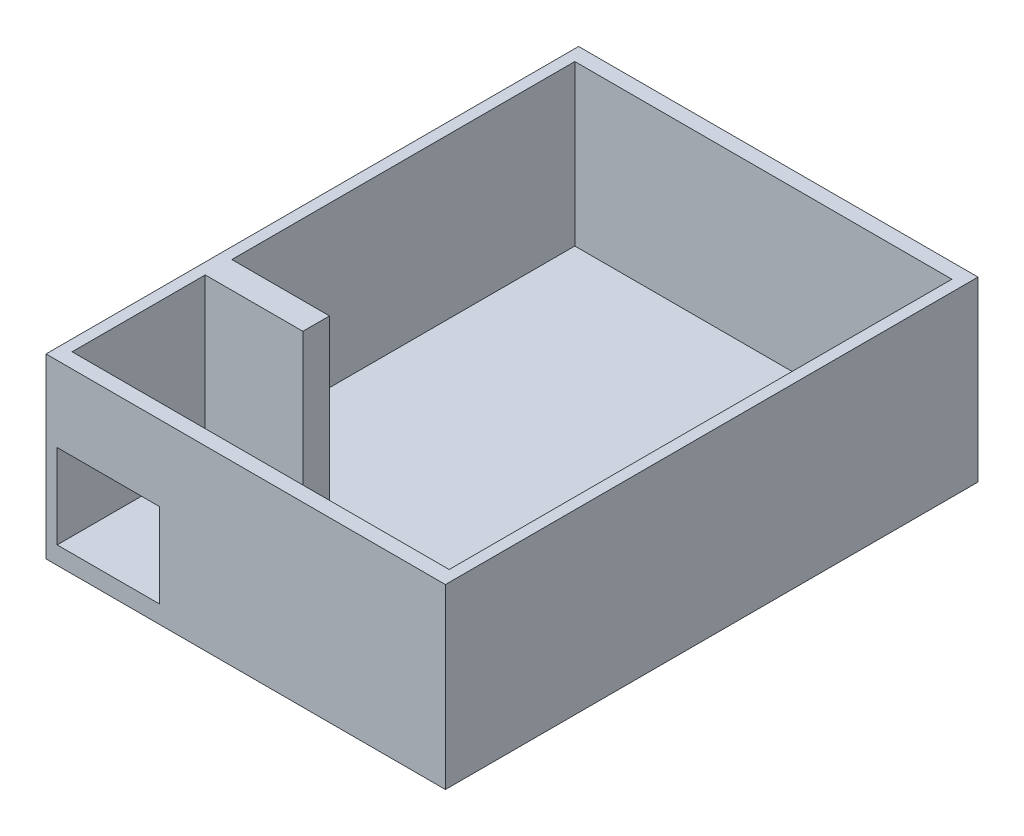
ISO-10303-21;
HEADER;
FILE_DESCRIPTION(('STEP AP214'),'2;1');
FILE_NAME('part.step','',(''),(''),'','','');
FILE_SCHEMA(('AUTOMOTIVE_DESIGN { 1 0 10303 214 1 1 1 1 }'));
ENDSEC;
DATA;
#1=APPLICATION_CONTEXT('core data for automotive mechanical design processes');
#2=APPLICATION_PROTOCOL_DEFINITION('international standard','automotive_design',2000,#1);
#3=PRODUCT_CONTEXT('',#1,'mechanical');
#4=PRODUCT('Part','Part','',(#3));
#5=PRODUCT_RELATED_PRODUCT_CATEGORY('part','',(#4));
#6=PRODUCT_DEFINITION_FORMATION('','',#4);
#7=PRODUCT_DEFINITION_CONTEXT('part definition',#1,'design');
#8=PRODUCT_DEFINITION('design','',#6,#7);
#9=PRODUCT_DEFINITION_SHAPE('','',#8);
#10=(LENGTH_UNIT() NAMED_UNIT(*) SI_UNIT(.MILLI.,.METRE.));
#11=(NAMED_UNIT(*) PLANE_ANGLE_UNIT() SI_UNIT($,.RADIAN.));
#12=(NAMED_UNIT(*) SI_UNIT($,.STERADIAN.) SOLID_ANGLE_UNIT());
#13=UNCERTAINTY_MEASURE_WITH_UNIT(LENGTH_MEASURE(1.E-05),#10,'distance_accuracy_value','');
#14=(GEOMETRIC_REPRESENTATION_CONTEXT(3) GLOBAL_UNCERTAINTY_ASSIGNED_CONTEXT((#13)) GLOBAL_UNIT_ASSIGNED_CONTEXT((#10,
#11,#12)) REPRESENTATION_CONTEXT('',''));
#15=CARTESIAN_POINT('',(0.,0.,0.));
#16=DIRECTION('',(0.,0.,1.));
#17=DIRECTION('',(1.,0.,0.));
#18=AXIS2_PLACEMENT_3D('',#15,#16,#17);
#19=CARTESIAN_POINT('',(-21.24,20.,28.32));
#20=DIRECTION('',(1.,0.,0.));
#21=DIRECTION('',(0.,0.,-1.));
#22=AXIS2_PLACEMENT_3D('',#19,#20,#21);
#23=PLANE('',#22);
#24=DIRECTION('',(0.,0.,1.));
#25=VECTOR('',#24,1.);
#26=CARTESIAN_POINT('',(-21.24,2.,28.32));
#27=LINE('',#26,#25);
#28=CARTESIAN_POINT('',(-21.24,2.,13.32));
#29=VERTEX_POINT('',#28);
#30=CARTESIAN_POINT('',(-21.24,2.,30.));
#31=VERTEX_POINT('',#30);
#32=EDGE_CURVE('E159',#29,#31,#27,.T.);
#33=ORIENTED_EDGE('',*,*,#32,.F.);
#34=DIRECTION('',(0.,-1.,0.));
#35=VECTOR('',#34,1.);
#36=CARTESIAN_POINT('',(-21.24,20.,13.32));
#37=LINE('',#36,#35);
#38=CARTESIAN_POINT('',(-21.24,20.,13.32));
#39=VERTEX_POINT('',#38);
#40=EDGE_CURVE('E143',#39,#29,#37,.T.);
#41=ORIENTED_EDGE('',*,*,#40,.F.);
#42=DIRECTION('',(0.,0.,1.));
#43=VECTOR('',#42,1.);
#44=CARTESIAN_POINT('',(-21.24,20.,28.32));
#45=LINE('',#44,#43);
#46=CARTESIAN_POINT('',(-21.24,20.,28.32));
#47=VERTEX_POINT('',#46);
#48=EDGE_CURVE('E156',#39,#47,#45,.T.);
#49=ORIENTED_EDGE('',*,*,#48,.T.);
#50=DIRECTION('',(0.,-1.,0.));
#51=VECTOR('',#50,1.);
#52=CARTESIAN_POINT('',(-21.24,20.,28.32));
#53=LINE('',#52,#51);
#54=CARTESIAN_POINT('',(-21.24,11.5,28.32));
#55=VERTEX_POINT('',#54);
#56=EDGE_CURVE('E197',#47,#55,#53,.T.);
#57=ORIENTED_EDGE('',*,*,#56,.T.);
#58=DIRECTION('',(0.,0.,1.));
#59=VECTOR('',#58,1.);
#60=CARTESIAN_POINT('',(-21.24,11.5,12.));
#61=LINE('',#60,#59);
#62=CARTESIAN_POINT('',(-21.24,11.5,30.));
#63=VERTEX_POINT('',#62);
#64=EDGE_CURVE('E326',#55,#63,#61,.T.);
#65=ORIENTED_EDGE('',*,*,#64,.T.);
#66=DIRECTION('',(0.,-1.,0.));
#67=VECTOR('',#66,1.);
#68=CARTESIAN_POINT('',(-21.24,11.5,30.));
#69=LINE('',#68,#67);
#70=EDGE_CURVE('E318',#63,#31,#69,.T.);
#71=ORIENTED_EDGE('',*,*,#70,.T.);
#72=EDGE_LOOP('',(#33,#41,#49,#57,#65,#71));
#73=FACE_BOUND('',#72,.T.);
#74=ADVANCED_FACE('F33',(#73),#23,.T.);
#75=CARTESIAN_POINT('',(-21.24,20.,-28.32));
#76=VERTEX_POINT('',#75);
#77=CARTESIAN_POINT('',(-21.24,20.,10.32));
#78=VERTEX_POINT('',#77);
#79=EDGE_CURVE('E166',#76,#78,#45,.T.);
#80=ORIENTED_EDGE('',*,*,#79,.T.);
#81=DIRECTION('',(0.,-1.,0.));
#82=VECTOR('',#81,1.);
#83=CARTESIAN_POINT('',(-21.24,20.,10.32));
#84=LINE('',#83,#82);
#85=CARTESIAN_POINT('',(-21.24,2.,10.32));
#86=VERTEX_POINT('',#85);
#87=EDGE_CURVE('E294',#78,#86,#84,.T.);
#88=ORIENTED_EDGE('',*,*,#87,.T.);
#89=CARTESIAN_POINT('',(-21.24,2.,-28.32));
#90=VERTEX_POINT('',#89);
#91=EDGE_CURVE('E183',#90,#86,#27,.T.);
#92=ORIENTED_EDGE('',*,*,#91,.F.);
#93=DIRECTION('',(0.,-1.,0.));
#94=VECTOR('',#93,1.);
#95=CARTESIAN_POINT('',(-21.24,20.,-28.32));
#96=LINE('',#95,#94);
#97=EDGE_CURVE('E182',#76,#90,#96,.T.);
#98=ORIENTED_EDGE('',*,*,#97,.F.);
#99=EDGE_LOOP('',(#80,#88,#92,#98));
#100=FACE_BOUND('',#99,.T.);
#101=ADVANCED_FACE('F260',(#100),#23,.T.);
#102=CARTESIAN_POINT('',(0.,2.,0.));
#103=DIRECTION('',(0.,1.,0.));
#104=DIRECTION('',(0.,0.,1.));
#105=AXIS2_PLACEMENT_3D('',#102,#103,#104);
#106=PLANE('',#105);
#107=DIRECTION('',(0.,0.,-1.));
#108=VECTOR('',#107,1.);
#109=CARTESIAN_POINT('',(-10.24,2.,13.32));
#110=LINE('',#109,#108);
#111=CARTESIAN_POINT('',(-10.24,2.,13.32));
#112=VERTEX_POINT('',#111);
#113=CARTESIAN_POINT('',(-10.24,2.,10.32));
#114=VERTEX_POINT('',#113);
#115=EDGE_CURVE('E297',#112,#114,#110,.T.);
#116=ORIENTED_EDGE('',*,*,#115,.F.);
#117=DIRECTION('',(1.,0.,0.));
#118=VECTOR('',#117,1.);
#119=CARTESIAN_POINT('',(-21.24,2.,13.32));
#120=LINE('',#119,#118);
#121=EDGE_CURVE('E309',#29,#112,#120,.T.);
#122=ORIENTED_EDGE('',*,*,#121,.F.);
#123=ORIENTED_EDGE('',*,*,#32,.T.);
#124=DIRECTION('',(1.,0.,0.));
#125=VECTOR('',#124,1.);
#126=CARTESIAN_POINT('',(-21.24,2.,30.));
#127=LINE('',#126,#125);
#128=CARTESIAN_POINT('',(-9.73999999999999,2.,30.));
#129=VERTEX_POINT('',#128);
#130=EDGE_CURVE('E320',#31,#129,#127,.T.);
#131=ORIENTED_EDGE('',*,*,#130,.T.);
#132=DIRECTION('',(0.,0.,1.));
#133=VECTOR('',#132,1.);
#134=CARTESIAN_POINT('',(-9.73999999999999,2.,12.));
#135=LINE('',#134,#133);
#136=CARTESIAN_POINT('',(-9.73999999999999,2.,28.32));
#137=VERTEX_POINT('',#136);
#138=EDGE_CURVE('E324',#137,#129,#135,.T.);
#139=ORIENTED_EDGE('',*,*,#138,.F.);
#140=DIRECTION('',(1.,0.,0.));
#141=VECTOR('',#140,1.);
#142=CARTESIAN_POINT('',(21.24,2.,28.32));
#143=LINE('',#142,#141);
#144=CARTESIAN_POINT('',(21.24,2.,28.32));
#145=VERTEX_POINT('',#144);
#146=EDGE_CURVE('E186',#137,#145,#143,.T.);
#147=ORIENTED_EDGE('',*,*,#146,.T.);
#148=DIRECTION('',(0.,0.,-1.));
#149=VECTOR('',#148,1.);
#150=CARTESIAN_POINT('',(21.24,2.,28.32));
#151=LINE('',#150,#149);
#152=CARTESIAN_POINT('',(21.24,2.,-28.32));
#153=VERTEX_POINT('',#152);
#154=EDGE_CURVE('E170',#145,#153,#151,.T.);
#155=ORIENTED_EDGE('',*,*,#154,.T.);
#156=DIRECTION('',(-1.,0.,0.));
#157=VECTOR('',#156,1.);
#158=CARTESIAN_POINT('',(21.24,2.,-28.32));
#159=LINE('',#158,#157);
#160=EDGE_CURVE('E167',#153,#90,#159,.T.);
#161=ORIENTED_EDGE('',*,*,#160,.T.);
#162=ORIENTED_EDGE('',*,*,#91,.T.);
#163=DIRECTION('',(-1.,0.,0.));
#164=VECTOR('',#163,1.);
#165=CARTESIAN_POINT('',(-10.24,2.,10.32));
#166=LINE('',#165,#164);
#167=EDGE_CURVE('E151',#114,#86,#166,.T.);
#168=ORIENTED_EDGE('',*,*,#167,.F.);
#169=EDGE_LOOP('',(#116,#122,#123,#131,#139,#147,#155,#161,#162,#168));
#170=FACE_BOUND('',#169,.T.);
#171=ADVANCED_FACE('F264',(#170),#106,.T.);
#172=CARTESIAN_POINT('',(22.5,2.,-30.));
#173=DIRECTION('',(-1.,0.,0.));
#174=DIRECTION('',(0.,0.,1.));
#175=AXIS2_PLACEMENT_3D('',#172,#173,#174);
#176=PLANE('',#175);
#177=DIRECTION('',(0.,0.,-1.));
#178=VECTOR('',#177,1.);
#179=CARTESIAN_POINT('',(22.5,0.,-30.));
#180=LINE('',#179,#178);
#181=CARTESIAN_POINT('',(22.5,0.,30.));
#182=VERTEX_POINT('',#181);
#183=CARTESIAN_POINT('',(22.5,0.,-30.));
#184=VERTEX_POINT('',#183);
#185=EDGE_CURVE('E211',#182,#184,#180,.T.);
#186=ORIENTED_EDGE('',*,*,#185,.T.);
#187=DIRECTION('',(0.,-1.,0.));
#188=VECTOR('',#187,1.);
#189=CARTESIAN_POINT('',(22.5,2.,-30.));
#190=LINE('',#189,#188);
#191=CARTESIAN_POINT('',(22.5,20.,-30.));
#192=VERTEX_POINT('',#191);
#193=EDGE_CURVE('E41',#192,#184,#190,.T.);
#194=ORIENTED_EDGE('',*,*,#193,.F.);
#195=DIRECTION('',(0.,0.,-1.));
#196=VECTOR('',#195,1.);
#197=CARTESIAN_POINT('',(22.5,20.,30.));
#198=LINE('',#197,#196);
#199=CARTESIAN_POINT('',(22.5,20.,30.));
#200=VERTEX_POINT('',#199);
#201=EDGE_CURVE('E199',#200,#192,#198,.T.);
#202=ORIENTED_EDGE('',*,*,#201,.F.);
#203=DIRECTION('',(0.,-1.,0.));
#204=VECTOR('',#203,1.);
#205=CARTESIAN_POINT('',(22.5,2.,30.));
#206=LINE('',#205,#204);
#207=EDGE_CURVE('E220',#200,#182,#206,.T.);
#208=ORIENTED_EDGE('',*,*,#207,.T.);
#209=EDGE_LOOP('',(#186,#194,#202,#208));
#210=FACE_BOUND('',#209,.T.);
#211=ADVANCED_FACE('F35',(#210),#176,.F.);
#212=CARTESIAN_POINT('',(-22.5,2.,-30.));
#213=DIRECTION('',(0.,0.,1.));
#214=DIRECTION('',(1.,0.,0.));
#215=AXIS2_PLACEMENT_3D('',#212,#213,#214);
#216=PLANE('',#215);
#217=DIRECTION('',(-1.,0.,0.));
#218=VECTOR('',#217,1.);
#219=CARTESIAN_POINT('',(-22.5,0.,-30.));
#220=LINE('',#219,#218);
#221=CARTESIAN_POINT('',(-22.5,0.,-30.));
#222=VERTEX_POINT('',#221);
#223=EDGE_CURVE('E214',#184,#222,#220,.T.);
#224=ORIENTED_EDGE('',*,*,#223,.T.);
#225=DIRECTION('',(0.,-1.,0.));
#226=VECTOR('',#225,1.);
#227=CARTESIAN_POINT('',(-22.5,2.,-30.));
#228=LINE('',#227,#226);
#229=CARTESIAN_POINT('',(-22.5,20.,-30.));
#230=VERTEX_POINT('',#229);
#231=EDGE_CURVE('E226',#230,#222,#228,.T.);
#232=ORIENTED_EDGE('',*,*,#231,.F.);
#233=DIRECTION('',(-1.,0.,0.));
#234=VECTOR('',#233,1.);
#235=CARTESIAN_POINT('',(-22.5,20.,-30.));
#236=LINE('',#235,#234);
#237=EDGE_CURVE('E202',#192,#230,#236,.T.);
#238=ORIENTED_EDGE('',*,*,#237,.F.);
#239=ORIENTED_EDGE('',*,*,#193,.T.);
#240=EDGE_LOOP('',(#224,#232,#238,#239));
#241=FACE_BOUND('',#240,.T.);
#242=ADVANCED_FACE('F231',(#241),#216,.F.);
#243=CARTESIAN_POINT('',(-22.5,2.,-30.));
#244=DIRECTION('',(1.,0.,0.));
#245=DIRECTION('',(0.,0.,-1.));
#246=AXIS2_PLACEMENT_3D('',#243,#244,#245);
#247=PLANE('',#246);
#248=DIRECTION('',(0.,0.,1.));
#249=VECTOR('',#248,1.);
#250=CARTESIAN_POINT('',(-22.5,0.,-30.));
#251=LINE('',#250,#249);
#252=CARTESIAN_POINT('',(-22.5,0.,30.));
#253=VERTEX_POINT('',#252);
#254=EDGE_CURVE('E216',#222,#253,#251,.T.);
#255=ORIENTED_EDGE('',*,*,#254,.T.);
#256=DIRECTION('',(0.,-1.,0.));
#257=VECTOR('',#256,1.);
#258=CARTESIAN_POINT('',(-22.5,2.,30.));
#259=LINE('',#258,#257);
#260=CARTESIAN_POINT('',(-22.5,20.,30.));
#261=VERTEX_POINT('',#260);
#262=EDGE_CURVE('E223',#261,#253,#259,.T.);
#263=ORIENTED_EDGE('',*,*,#262,.F.);
#264=DIRECTION('',(0.,0.,1.));
#265=VECTOR('',#264,1.);
#266=CARTESIAN_POINT('',(-22.5,20.,30.));
#267=LINE('',#266,#265);
#268=EDGE_CURVE('E205',#230,#261,#267,.T.);
#269=ORIENTED_EDGE('',*,*,#268,.F.);
#270=ORIENTED_EDGE('',*,*,#231,.T.);
#271=EDGE_LOOP('',(#255,#263,#269,#270));
#272=FACE_BOUND('',#271,.T.);
#273=ADVANCED_FACE('F240',(#272),#247,.F.);
#274=CARTESIAN_POINT('',(-22.5,2.,30.));
#275=DIRECTION('',(0.,0.,-1.));
#276=DIRECTION('',(-1.,0.,0.));
#277=AXIS2_PLACEMENT_3D('',#274,#275,#276);
#278=PLANE('',#277);
#279=DIRECTION('',(-1.,0.,0.));
#280=VECTOR('',#279,1.);
#281=CARTESIAN_POINT('',(-9.73999999999999,11.5,30.));
#282=LINE('',#281,#280);
#283=CARTESIAN_POINT('',(-9.73999999999999,11.5,30.));
#284=VERTEX_POINT('',#283);
#285=EDGE_CURVE('E315',#284,#63,#282,.T.);
#286=ORIENTED_EDGE('',*,*,#285,.F.);
#287=DIRECTION('',(0.,1.,0.));
#288=VECTOR('',#287,1.);
#289=CARTESIAN_POINT('',(-9.73999999999999,2.,30.));
#290=LINE('',#289,#288);
#291=EDGE_CURVE('E56',#129,#284,#290,.T.);
#292=ORIENTED_EDGE('',*,*,#291,.F.);
#293=ORIENTED_EDGE('',*,*,#130,.F.);
#294=ORIENTED_EDGE('',*,*,#70,.F.);
#295=EDGE_LOOP('',(#286,#292,#293,#294));
#296=FACE_BOUND('',#295,.T.);
#297=DIRECTION('',(1.,0.,0.));
#298=VECTOR('',#297,1.);
#299=CARTESIAN_POINT('',(-22.5,0.,30.));
#300=LINE('',#299,#298);
#301=EDGE_CURVE('E218',#253,#182,#300,.T.);
#302=ORIENTED_EDGE('',*,*,#301,.T.);
#303=ORIENTED_EDGE('',*,*,#207,.F.);
#304=DIRECTION('',(1.,0.,0.));
#305=VECTOR('',#304,1.);
#306=CARTESIAN_POINT('',(-22.5,20.,30.));
#307=LINE('',#306,#305);
#308=EDGE_CURVE('E208',#261,#200,#307,.T.);
#309=ORIENTED_EDGE('',*,*,#308,.F.);
#310=ORIENTED_EDGE('',*,*,#262,.T.);
#311=EDGE_LOOP('',(#302,#303,#309,#310));
#312=FACE_BOUND('',#311,.T.);
#313=ADVANCED_FACE('F244',(#296,#312),#278,.F.);
#314=CARTESIAN_POINT('',(0.,0.,0.));
#315=DIRECTION('',(0.,1.,0.));
#316=DIRECTION('',(0.,0.,1.));
#317=AXIS2_PLACEMENT_3D('',#314,#315,#316);
#318=PLANE('',#317);
#319=ORIENTED_EDGE('',*,*,#185,.F.);
#320=ORIENTED_EDGE('',*,*,#301,.F.);
#321=ORIENTED_EDGE('',*,*,#254,.F.);
#322=ORIENTED_EDGE('',*,*,#223,.F.);
#323=EDGE_LOOP('',(#319,#320,#321,#322));
#324=FACE_BOUND('',#323,.T.);
#325=ADVANCED_FACE('F237',(#324),#318,.F.);
#326=CARTESIAN_POINT('',(0.,20.,0.));
#327=DIRECTION('',(0.,-1.,0.));
#328=DIRECTION('',(0.,0.,-1.));
#329=AXIS2_PLACEMENT_3D('',#326,#327,#328);
#330=PLANE('',#329);
#331=ORIENTED_EDGE('',*,*,#201,.T.);
#332=ORIENTED_EDGE('',*,*,#237,.T.);
#333=ORIENTED_EDGE('',*,*,#268,.T.);
#334=ORIENTED_EDGE('',*,*,#308,.T.);
#335=EDGE_LOOP('',(#331,#332,#333,#334));
#336=FACE_BOUND('',#335,.T.);
#337=ORIENTED_EDGE('',*,*,#79,.F.);
#338=DIRECTION('',(-1.,0.,0.));
#339=VECTOR('',#338,1.);
#340=CARTESIAN_POINT('',(21.24,20.,-28.32));
#341=LINE('',#340,#339);
#342=CARTESIAN_POINT('',(21.24,20.,-28.32));
#343=VERTEX_POINT('',#342);
#344=EDGE_CURVE('E180',#343,#76,#341,.T.);
#345=ORIENTED_EDGE('',*,*,#344,.F.);
#346=DIRECTION('',(0.,0.,-1.));
#347=VECTOR('',#346,1.);
#348=CARTESIAN_POINT('',(21.24,20.,28.32));
#349=LINE('',#348,#347);
#350=CARTESIAN_POINT('',(21.24,20.,28.32));
#351=VERTEX_POINT('',#350);
#352=EDGE_CURVE('E177',#351,#343,#349,.T.);
#353=ORIENTED_EDGE('',*,*,#352,.F.);
#354=DIRECTION('',(1.,0.,0.));
#355=VECTOR('',#354,1.);
#356=CARTESIAN_POINT('',(21.24,20.,28.32));
#357=LINE('',#356,#355);
#358=EDGE_CURVE('E165',#47,#351,#357,.T.);
#359=ORIENTED_EDGE('',*,*,#358,.F.);
#360=ORIENTED_EDGE('',*,*,#48,.F.);
#361=DIRECTION('',(1.,0.,0.));
#362=VECTOR('',#361,1.);
#363=CARTESIAN_POINT('',(-21.24,20.,13.32));
#364=LINE('',#363,#362);
#365=CARTESIAN_POINT('',(-10.24,20.,13.32));
#366=VERTEX_POINT('',#365);
#367=EDGE_CURVE('E140',#39,#366,#364,.T.);
#368=ORIENTED_EDGE('',*,*,#367,.T.);
#369=DIRECTION('',(0.,0.,-1.));
#370=VECTOR('',#369,1.);
#371=CARTESIAN_POINT('',(-10.24,20.,13.32));
#372=LINE('',#371,#370);
#373=CARTESIAN_POINT('',(-10.24,20.,10.32));
#374=VERTEX_POINT('',#373);
#375=EDGE_CURVE('E150',#366,#374,#372,.T.);
#376=ORIENTED_EDGE('',*,*,#375,.T.);
#377=DIRECTION('',(-1.,0.,0.));
#378=VECTOR('',#377,1.);
#379=CARTESIAN_POINT('',(-10.24,20.,10.32));
#380=LINE('',#379,#378);
#381=EDGE_CURVE('E301',#374,#78,#380,.T.);
#382=ORIENTED_EDGE('',*,*,#381,.T.);
#383=EDGE_LOOP('',(#337,#345,#353,#359,#360,#368,#376,#382));
#384=FACE_BOUND('',#383,.T.);
#385=ADVANCED_FACE('F163',(#336,#384),#330,.F.);
#386=CARTESIAN_POINT('',(21.24,20.,28.32));
#387=DIRECTION('',(0.,0.,-1.));
#388=DIRECTION('',(-1.,0.,0.));
#389=AXIS2_PLACEMENT_3D('',#386,#387,#388);
#390=PLANE('',#389);
#391=DIRECTION('',(0.,-1.,0.));
#392=VECTOR('',#391,1.);
#393=CARTESIAN_POINT('',(-9.73999999999999,20.,28.32));
#394=LINE('',#393,#392);
#395=CARTESIAN_POINT('',(-9.73999999999999,11.5,28.32));
#396=VERTEX_POINT('',#395);
#397=EDGE_CURVE('E174',#396,#137,#394,.T.);
#398=ORIENTED_EDGE('',*,*,#397,.F.);
#399=DIRECTION('',(1.,0.,0.));
#400=VECTOR('',#399,1.);
#401=CARTESIAN_POINT('',(21.24,11.5,28.32));
#402=LINE('',#401,#400);
#403=EDGE_CURVE('E11',#55,#396,#402,.T.);
#404=ORIENTED_EDGE('',*,*,#403,.F.);
#405=ORIENTED_EDGE('',*,*,#56,.F.);
#406=ORIENTED_EDGE('',*,*,#358,.T.);
#407=DIRECTION('',(0.,-1.,0.));
#408=VECTOR('',#407,1.);
#409=CARTESIAN_POINT('',(21.24,20.,28.32));
#410=LINE('',#409,#408);
#411=EDGE_CURVE('E194',#351,#145,#410,.T.);
#412=ORIENTED_EDGE('',*,*,#411,.T.);
#413=ORIENTED_EDGE('',*,*,#146,.F.);
#414=EDGE_LOOP('',(#398,#404,#405,#406,#412,#413));
#415=FACE_BOUND('',#414,.T.);
#416=ADVANCED_FACE('F247',(#415),#390,.T.);
#417=CARTESIAN_POINT('',(21.24,20.,28.32));
#418=DIRECTION('',(-1.,0.,0.));
#419=DIRECTION('',(0.,0.,1.));
#420=AXIS2_PLACEMENT_3D('',#417,#418,#419);
#421=PLANE('',#420);
#422=ORIENTED_EDGE('',*,*,#154,.F.);
#423=ORIENTED_EDGE('',*,*,#411,.F.);
#424=ORIENTED_EDGE('',*,*,#352,.T.);
#425=DIRECTION('',(0.,-1.,0.));
#426=VECTOR('',#425,1.);
#427=CARTESIAN_POINT('',(21.24,20.,-28.32));
#428=LINE('',#427,#426);
#429=EDGE_CURVE('E191',#343,#153,#428,.T.);
#430=ORIENTED_EDGE('',*,*,#429,.T.);
#431=EDGE_LOOP('',(#422,#423,#424,#430));
#432=FACE_BOUND('',#431,.T.);
#433=ADVANCED_FACE('F253',(#432),#421,.T.);
#434=CARTESIAN_POINT('',(21.24,20.,-28.32));
#435=DIRECTION('',(0.,0.,1.));
#436=DIRECTION('',(1.,0.,0.));
#437=AXIS2_PLACEMENT_3D('',#434,#435,#436);
#438=PLANE('',#437);
#439=ORIENTED_EDGE('',*,*,#160,.F.);
#440=ORIENTED_EDGE('',*,*,#429,.F.);
#441=ORIENTED_EDGE('',*,*,#344,.T.);
#442=ORIENTED_EDGE('',*,*,#97,.T.);
#443=EDGE_LOOP('',(#439,#440,#441,#442));
#444=FACE_BOUND('',#443,.T.);
#445=ADVANCED_FACE('F269',(#444),#438,.T.);
#446=CARTESIAN_POINT('',(-9.73999999999999,2.,12.));
#447=DIRECTION('',(1.,0.,0.));
#448=DIRECTION('',(0.,0.,-1.));
#449=AXIS2_PLACEMENT_3D('',#446,#447,#448);
#450=PLANE('',#449);
#451=ORIENTED_EDGE('',*,*,#397,.T.);
#452=ORIENTED_EDGE('',*,*,#138,.T.);
#453=ORIENTED_EDGE('',*,*,#291,.T.);
#454=DIRECTION('',(0.,0.,1.));
#455=VECTOR('',#454,1.);
#456=CARTESIAN_POINT('',(-9.73999999999999,11.5,12.));
#457=LINE('',#456,#455);
#458=EDGE_CURVE('E323',#396,#284,#457,.T.);
#459=ORIENTED_EDGE('',*,*,#458,.F.);
#460=EDGE_LOOP('',(#451,#452,#453,#459));
#461=FACE_BOUND('',#460,.T.);
#462=ADVANCED_FACE('F273',(#461),#450,.F.);
#463=CARTESIAN_POINT('',(-9.73999999999999,11.5,12.));
#464=DIRECTION('',(0.,1.,0.));
#465=DIRECTION('',(0.,0.,1.));
#466=AXIS2_PLACEMENT_3D('',#463,#464,#465);
#467=PLANE('',#466);
#468=ORIENTED_EDGE('',*,*,#403,.T.);
#469=ORIENTED_EDGE('',*,*,#458,.T.);
#470=ORIENTED_EDGE('',*,*,#285,.T.);
#471=ORIENTED_EDGE('',*,*,#64,.F.);
#472=EDGE_LOOP('',(#468,#469,#470,#471));
#473=FACE_BOUND('',#472,.T.);
#474=ADVANCED_FACE('F277',(#473),#467,.F.);
#475=CARTESIAN_POINT('',(-21.24,20.,13.32));
#476=DIRECTION('',(0.,0.,-1.));
#477=DIRECTION('',(-1.,0.,0.));
#478=AXIS2_PLACEMENT_3D('',#475,#476,#477);
#479=PLANE('',#478);
#480=ORIENTED_EDGE('',*,*,#121,.T.);
#481=DIRECTION('',(0.,-1.,0.));
#482=VECTOR('',#481,1.);
#483=CARTESIAN_POINT('',(-10.24,20.,13.32));
#484=LINE('',#483,#482);
#485=EDGE_CURVE('E146',#366,#112,#484,.T.);
#486=ORIENTED_EDGE('',*,*,#485,.F.);
#487=ORIENTED_EDGE('',*,*,#367,.F.);
#488=ORIENTED_EDGE('',*,*,#40,.T.);
#489=EDGE_LOOP('',(#480,#486,#487,#488));
#490=FACE_BOUND('',#489,.T.);
#491=ADVANCED_FACE('F142',(#490),#479,.F.);
#492=CARTESIAN_POINT('',(-10.24,20.,13.32));
#493=DIRECTION('',(-1.,0.,0.));
#494=DIRECTION('',(0.,0.,1.));
#495=AXIS2_PLACEMENT_3D('',#492,#493,#494);
#496=PLANE('',#495);
#497=ORIENTED_EDGE('',*,*,#115,.T.);
#498=DIRECTION('',(0.,-1.,0.));
#499=VECTOR('',#498,1.);
#500=CARTESIAN_POINT('',(-10.24,20.,10.32));
#501=LINE('',#500,#499);
#502=EDGE_CURVE('E48',#374,#114,#501,.T.);
#503=ORIENTED_EDGE('',*,*,#502,.F.);
#504=ORIENTED_EDGE('',*,*,#375,.F.);
#505=ORIENTED_EDGE('',*,*,#485,.T.);
#506=EDGE_LOOP('',(#497,#503,#504,#505));
#507=FACE_BOUND('',#506,.T.);
#508=ADVANCED_FACE('F283',(#507),#496,.F.);
#509=CARTESIAN_POINT('',(-10.24,20.,10.32));
#510=DIRECTION('',(0.,0.,1.));
#511=DIRECTION('',(1.,0.,0.));
#512=AXIS2_PLACEMENT_3D('',#509,#510,#511);
#513=PLANE('',#512);
#514=ORIENTED_EDGE('',*,*,#167,.T.);
#515=ORIENTED_EDGE('',*,*,#87,.F.);
#516=ORIENTED_EDGE('',*,*,#381,.F.);
#517=ORIENTED_EDGE('',*,*,#502,.T.);
#518=EDGE_LOOP('',(#514,#515,#516,#517));
#519=FACE_BOUND('',#518,.T.);
#520=ADVANCED_FACE('F286',(#519),#513,.F.);
#521=CLOSED_SHELL('',(#74,#101,#171,#211,#242,#273,#313,#325,#385,#416,#433,#445,#462,#474,#491,
#508,#520));
#522=MANIFOLD_SOLID_BREP('B2',#521);
#523=ADVANCED_BREP_SHAPE_REPRESENTATION('',(#18,#522),#14);
#524=SHAPE_DEFINITION_REPRESENTATION(#9,#523);
ENDSEC;
END-ISO-10303-21;
